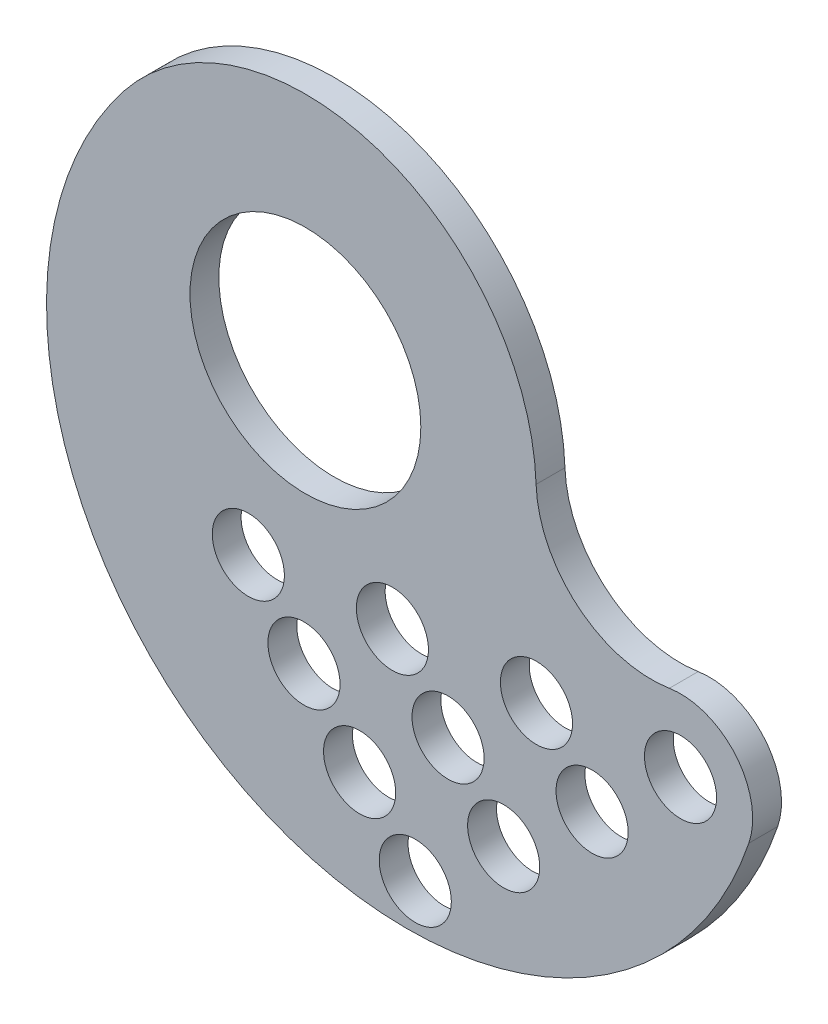
ISO-10303-21;
HEADER;
FILE_DESCRIPTION(('STEP AP214'),'2;1');
FILE_NAME('part.step','',(''),(''),'','','');
FILE_SCHEMA(('AUTOMOTIVE_DESIGN { 1 0 10303 214 1 1 1 1 }'));
ENDSEC;
DATA;
#1=APPLICATION_CONTEXT('core data for automotive mechanical design processes');
#2=APPLICATION_PROTOCOL_DEFINITION('international standard','automotive_design',2000,#1);
#3=PRODUCT_CONTEXT('',#1,'mechanical');
#4=PRODUCT('Part','Part','',(#3));
#5=PRODUCT_RELATED_PRODUCT_CATEGORY('part','',(#4));
#6=PRODUCT_DEFINITION_FORMATION('','',#4);
#7=PRODUCT_DEFINITION_CONTEXT('part definition',#1,'design');
#8=PRODUCT_DEFINITION('design','',#6,#7);
#9=PRODUCT_DEFINITION_SHAPE('','',#8);
#10=(LENGTH_UNIT() NAMED_UNIT(*) SI_UNIT(.MILLI.,.METRE.));
#11=(NAMED_UNIT(*) PLANE_ANGLE_UNIT() SI_UNIT($,.RADIAN.));
#12=(NAMED_UNIT(*) SI_UNIT($,.STERADIAN.) SOLID_ANGLE_UNIT());
#13=UNCERTAINTY_MEASURE_WITH_UNIT(LENGTH_MEASURE(1.E-05),#10,'distance_accuracy_value','');
#14=(GEOMETRIC_REPRESENTATION_CONTEXT(3) GLOBAL_UNCERTAINTY_ASSIGNED_CONTEXT((#13)) GLOBAL_UNIT_ASSIGNED_CONTEXT((#10,
#11,#12)) REPRESENTATION_CONTEXT('',''));
#15=CARTESIAN_POINT('',(0.,0.,0.));
#16=DIRECTION('',(0.,0.,1.));
#17=DIRECTION('',(1.,0.,0.));
#18=AXIS2_PLACEMENT_3D('',#15,#16,#17);
#19=CARTESIAN_POINT('',(124.962982776865,-27.8927039834581,10.));
#20=DIRECTION('',(0.,0.,1.));
#21=DIRECTION('',(1.,0.,0.));
#22=AXIS2_PLACEMENT_3D('',#19,#20,#21);
#23=PLANE('',#22);
#24=CARTESIAN_POINT('',(-0.492589755469286,-91.171846575247,10.));
#25=DIRECTION('',(0.,0.,1.));
#26=DIRECTION('',(1.,0.,0.));
#27=AXIS2_PLACEMENT_3D('',#24,#25,#26);
#28=CIRCLE('',#27,12.5);
#29=CARTESIAN_POINT('',(12.0074102445307,-91.171846575247,10.));
#30=VERTEX_POINT('',#29);
#31=EDGE_CURVE('E166',#30,#30,#28,.T.);
#32=ORIENTED_EDGE('',*,*,#31,.F.);
#33=EDGE_LOOP('',(#32));
#34=FACE_BOUND('',#33,.T.);
#35=CARTESIAN_POINT('',(18.791038535127,-114.153179868816,10.));
#36=DIRECTION('',(0.,0.,1.));
#37=DIRECTION('',(1.,0.,0.));
#38=AXIS2_PLACEMENT_3D('',#35,#36,#37);
#39=CIRCLE('',#38,12.5);
#40=CARTESIAN_POINT('',(31.291038535127,-114.153179868816,10.));
#41=VERTEX_POINT('',#40);
#42=EDGE_CURVE('E154',#41,#41,#39,.T.);
#43=ORIENTED_EDGE('',*,*,#42,.F.);
#44=EDGE_LOOP('',(#43));
#45=FACE_BOUND('',#44,.T.);
#46=CARTESIAN_POINT('',(80.0745939846448,-62.7301710938926,10.));
#47=DIRECTION('',(0.,0.,1.));
#48=DIRECTION('',(1.,0.,0.));
#49=AXIS2_PLACEMENT_3D('',#46,#47,#48);
#50=CIRCLE('',#49,12.5);
#51=CARTESIAN_POINT('',(92.5745939846448,-62.7301710938926,10.));
#52=VERTEX_POINT('',#51);
#53=EDGE_CURVE('E142',#52,#52,#50,.T.);
#54=ORIENTED_EDGE('',*,*,#53,.F.);
#55=EDGE_LOOP('',(#54));
#56=FACE_BOUND('',#55,.T.);
#57=CARTESIAN_POINT('',(68.7164445504822,-111.423008774924,10.));
#58=DIRECTION('',(0.,0.,1.));
#59=DIRECTION('',(1.,0.,0.));
#60=AXIS2_PLACEMENT_3D('',#57,#58,#59);
#61=CIRCLE('',#60,12.5);
#62=CARTESIAN_POINT('',(81.2164445504822,-111.423008774924,10.));
#63=VERTEX_POINT('',#62);
#64=EDGE_CURVE('E130',#63,#63,#61,.T.);
#65=ORIENTED_EDGE('',*,*,#64,.F.);
#66=EDGE_LOOP('',(#65));
#67=FACE_BOUND('',#66,.T.);
#68=CARTESIAN_POINT('',(130.,-60.,10.));
#69=DIRECTION('',(0.,0.,1.));
#70=DIRECTION('',(1.,0.,0.));
#71=AXIS2_PLACEMENT_3D('',#68,#69,#70);
#72=CIRCLE('',#71,12.5);
#73=CARTESIAN_POINT('',(142.5,-60.,10.));
#74=VERTEX_POINT('',#73);
#75=EDGE_CURVE('E118',#74,#74,#72,.T.);
#76=ORIENTED_EDGE('',*,*,#75,.F.);
#77=EDGE_LOOP('',(#76));
#78=FACE_BOUND('',#77,.T.);
#79=CARTESIAN_POINT('',(119.925965553731,4.21459203308376,10.));
#80=DIRECTION('',(0.,0.,-1.));
#81=DIRECTION('',(1.,0.,0.));
#82=AXIS2_PLACEMENT_3D('',#79,#80,#81);
#83=CIRCLE('',#82,40.);
#84=CARTESIAN_POINT('',(126.12537136682,-35.3020799872755,10.));
#85=VERTEX_POINT('',#84);
#86=CARTESIAN_POINT('',(79.9506437024873,2.80972802205584,10.));
#87=VERTEX_POINT('',#86);
#88=EDGE_CURVE('E88',#85,#87,#83,.T.);
#89=ORIENTED_EDGE('',*,*,#88,.T.);
#90=CARTESIAN_POINT('',(0.,0.,10.));
#91=DIRECTION('',(0.,0.,1.));
#92=DIRECTION('',(1.,0.,0.));
#93=AXIS2_PLACEMENT_3D('',#90,#91,#92);
#94=CIRCLE('',#93,80.);
#95=CARTESIAN_POINT('',(-62.7215009406275,49.6589701841959,10.));
#96=VERTEX_POINT('',#95);
#97=EDGE_CURVE('E83',#87,#96,#94,.T.);
#98=ORIENTED_EDGE('',*,*,#97,.T.);
#99=CARTESIAN_POINT('',(35.280844279103,-27.9331707286102,10.));
#100=DIRECTION('',(0.,0.,1.));
#101=DIRECTION('',(1.,0.,0.));
#102=AXIS2_PLACEMENT_3D('',#99,#100,#101);
#103=CIRCLE('',#102,125.);
#104=CARTESIAN_POINT('',(153.679788930224,-68.0167073178475,10.));
#105=VERTEX_POINT('',#104);
#106=EDGE_CURVE('E86',#96,#105,#103,.T.);
#107=ORIENTED_EDGE('',*,*,#106,.T.);
#108=CARTESIAN_POINT('',(130.,-60.,10.));
#109=DIRECTION('',(0.,0.,1.));
#110=DIRECTION('',(1.,0.,0.));
#111=AXIS2_PLACEMENT_3D('',#108,#109,#110);
#112=CIRCLE('',#111,25.);
#113=EDGE_CURVE('E53',#105,#85,#112,.T.);
#114=ORIENTED_EDGE('',*,*,#113,.T.);
#115=EDGE_LOOP('',(#89,#98,#107,#114));
#116=FACE_BOUND('',#115,.T.);
#117=CARTESIAN_POINT('',(0.,0.,10.));
#118=DIRECTION('',(0.,0.,1.));
#119=DIRECTION('',(1.,0.,0.));
#120=AXIS2_PLACEMENT_3D('',#117,#118,#119);
#121=CIRCLE('',#120,40.);
#122=CARTESIAN_POINT('',(40.,0.,10.));
#123=VERTEX_POINT('',#122);
#124=EDGE_CURVE('E103',#123,#123,#121,.T.);
#125=ORIENTED_EDGE('',*,*,#124,.F.);
#126=EDGE_LOOP('',(#125));
#127=FACE_BOUND('',#126,.T.);
#128=CARTESIAN_POINT('',(99.3582222752411,-85.7115043874618,10.));
#129=DIRECTION('',(0.,0.,1.));
#130=DIRECTION('',(1.,0.,0.));
#131=AXIS2_PLACEMENT_3D('',#128,#129,#130);
#132=CIRCLE('',#131,12.5);
#133=CARTESIAN_POINT('',(111.858222275241,-85.7115043874618,10.));
#134=VERTEX_POINT('',#133);
#135=EDGE_CURVE('E124',#134,#134,#132,.T.);
#136=ORIENTED_EDGE('',*,*,#135,.F.);
#137=EDGE_LOOP('',(#136));
#138=FACE_BOUND('',#137,.T.);
#139=CARTESIAN_POINT('',(38.0746668257233,-137.134513162386,10.));
#140=DIRECTION('',(0.,0.,1.));
#141=DIRECTION('',(1.,0.,0.));
#142=AXIS2_PLACEMENT_3D('',#139,#140,#141);
#143=CIRCLE('',#142,12.5);
#144=CARTESIAN_POINT('',(50.5746668257233,-137.134513162386,10.));
#145=VERTEX_POINT('',#144);
#146=EDGE_CURVE('E136',#145,#145,#143,.T.);
#147=ORIENTED_EDGE('',*,*,#146,.F.);
#148=EDGE_LOOP('',(#147));
#149=FACE_BOUND('',#148,.T.);
#150=CARTESIAN_POINT('',(49.4328162598859,-88.4416754813544,10.));
#151=DIRECTION('',(0.,0.,1.));
#152=DIRECTION('',(1.,0.,0.));
#153=AXIS2_PLACEMENT_3D('',#150,#151,#152);
#154=CIRCLE('',#153,12.5);
#155=CARTESIAN_POINT('',(61.9328162598859,-88.4416754813544,10.));
#156=VERTEX_POINT('',#155);
#157=EDGE_CURVE('E148',#156,#156,#154,.T.);
#158=ORIENTED_EDGE('',*,*,#157,.F.);
#159=EDGE_LOOP('',(#158));
#160=FACE_BOUND('',#159,.T.);
#161=CARTESIAN_POINT('',(30.1491879692896,-65.4603421877852,10.));
#162=DIRECTION('',(0.,0.,1.));
#163=DIRECTION('',(1.,0.,0.));
#164=AXIS2_PLACEMENT_3D('',#161,#162,#163);
#165=CIRCLE('',#164,12.5);
#166=CARTESIAN_POINT('',(42.6491879692896,-65.4603421877852,10.));
#167=VERTEX_POINT('',#166);
#168=EDGE_CURVE('E160',#167,#167,#165,.T.);
#169=ORIENTED_EDGE('',*,*,#168,.F.);
#170=EDGE_LOOP('',(#169));
#171=FACE_BOUND('',#170,.T.);
#172=CARTESIAN_POINT('',(-19.7762180460656,-68.1905132816778,10.));
#173=DIRECTION('',(0.,0.,1.));
#174=DIRECTION('',(1.,0.,0.));
#175=AXIS2_PLACEMENT_3D('',#172,#173,#174);
#176=CIRCLE('',#175,12.5);
#177=CARTESIAN_POINT('',(-7.27621804606558,-68.1905132816778,10.));
#178=VERTEX_POINT('',#177);
#179=EDGE_CURVE('E172',#178,#178,#176,.T.);
#180=ORIENTED_EDGE('',*,*,#179,.F.);
#181=EDGE_LOOP('',(#180));
#182=FACE_BOUND('',#181,.T.);
#183=ADVANCED_FACE('F36',(#34,#45,#56,#67,#78,#116,#127,#138,#149,#160,#171,#182),#23,.T.);
#184=CARTESIAN_POINT('',(124.962982776865,-27.8927039834581,0.));
#185=DIRECTION('',(0.,0.,1.));
#186=DIRECTION('',(1.,0.,0.));
#187=AXIS2_PLACEMENT_3D('',#184,#185,#186);
#188=PLANE('',#187);
#189=CARTESIAN_POINT('',(119.925965553731,4.21459203308376,0.));
#190=DIRECTION('',(0.,0.,-1.));
#191=DIRECTION('',(1.,0.,0.));
#192=AXIS2_PLACEMENT_3D('',#189,#190,#191);
#193=CIRCLE('',#192,40.);
#194=CARTESIAN_POINT('',(126.12537136682,-35.3020799872755,0.));
#195=VERTEX_POINT('',#194);
#196=CARTESIAN_POINT('',(79.9506437024873,2.80972802205584,0.));
#197=VERTEX_POINT('',#196);
#198=EDGE_CURVE('E100',#195,#197,#193,.T.);
#199=ORIENTED_EDGE('',*,*,#198,.F.);
#200=CARTESIAN_POINT('',(130.,-60.,0.));
#201=DIRECTION('',(0.,0.,1.));
#202=DIRECTION('',(1.,0.,0.));
#203=AXIS2_PLACEMENT_3D('',#200,#201,#202);
#204=CIRCLE('',#203,25.);
#205=CARTESIAN_POINT('',(153.679788930224,-68.0167073178475,0.));
#206=VERTEX_POINT('',#205);
#207=EDGE_CURVE('E76',#206,#195,#204,.T.);
#208=ORIENTED_EDGE('',*,*,#207,.F.);
#209=CARTESIAN_POINT('',(35.280844279103,-27.9331707286102,0.));
#210=DIRECTION('',(0.,0.,1.));
#211=DIRECTION('',(1.,0.,0.));
#212=AXIS2_PLACEMENT_3D('',#209,#210,#211);
#213=CIRCLE('',#212,125.);
#214=CARTESIAN_POINT('',(-62.7215009406275,49.6589701841959,0.));
#215=VERTEX_POINT('',#214);
#216=EDGE_CURVE('E70',#215,#206,#213,.T.);
#217=ORIENTED_EDGE('',*,*,#216,.F.);
#218=CARTESIAN_POINT('',(0.,0.,0.));
#219=DIRECTION('',(0.,0.,1.));
#220=DIRECTION('',(1.,0.,0.));
#221=AXIS2_PLACEMENT_3D('',#218,#219,#220);
#222=CIRCLE('',#221,80.);
#223=EDGE_CURVE('E92',#197,#215,#222,.T.);
#224=ORIENTED_EDGE('',*,*,#223,.F.);
#225=EDGE_LOOP('',(#199,#208,#217,#224));
#226=FACE_BOUND('',#225,.T.);
#227=CARTESIAN_POINT('',(0.,0.,0.));
#228=DIRECTION('',(0.,0.,1.));
#229=DIRECTION('',(1.,0.,0.));
#230=AXIS2_PLACEMENT_3D('',#227,#228,#229);
#231=CIRCLE('',#230,40.);
#232=CARTESIAN_POINT('',(40.,0.,0.));
#233=VERTEX_POINT('',#232);
#234=EDGE_CURVE('E115',#233,#233,#231,.T.);
#235=ORIENTED_EDGE('',*,*,#234,.T.);
#236=EDGE_LOOP('',(#235));
#237=FACE_BOUND('',#236,.T.);
#238=CARTESIAN_POINT('',(130.,-60.,0.));
#239=DIRECTION('',(0.,0.,1.));
#240=DIRECTION('',(1.,0.,0.));
#241=AXIS2_PLACEMENT_3D('',#238,#239,#240);
#242=CIRCLE('',#241,12.5);
#243=CARTESIAN_POINT('',(142.5,-60.,0.));
#244=VERTEX_POINT('',#243);
#245=EDGE_CURVE('E121',#244,#244,#242,.T.);
#246=ORIENTED_EDGE('',*,*,#245,.T.);
#247=EDGE_LOOP('',(#246));
#248=FACE_BOUND('',#247,.T.);
#249=CARTESIAN_POINT('',(99.3582222752411,-85.7115043874618,0.));
#250=DIRECTION('',(0.,0.,1.));
#251=DIRECTION('',(1.,0.,0.));
#252=AXIS2_PLACEMENT_3D('',#249,#250,#251);
#253=CIRCLE('',#252,12.5);
#254=CARTESIAN_POINT('',(111.858222275241,-85.7115043874618,0.));
#255=VERTEX_POINT('',#254);
#256=EDGE_CURVE('E127',#255,#255,#253,.T.);
#257=ORIENTED_EDGE('',*,*,#256,.T.);
#258=EDGE_LOOP('',(#257));
#259=FACE_BOUND('',#258,.T.);
#260=CARTESIAN_POINT('',(68.7164445504822,-111.423008774924,0.));
#261=DIRECTION('',(0.,0.,1.));
#262=DIRECTION('',(1.,0.,0.));
#263=AXIS2_PLACEMENT_3D('',#260,#261,#262);
#264=CIRCLE('',#263,12.5);
#265=CARTESIAN_POINT('',(81.2164445504822,-111.423008774924,0.));
#266=VERTEX_POINT('',#265);
#267=EDGE_CURVE('E133',#266,#266,#264,.T.);
#268=ORIENTED_EDGE('',*,*,#267,.T.);
#269=EDGE_LOOP('',(#268));
#270=FACE_BOUND('',#269,.T.);
#271=CARTESIAN_POINT('',(38.0746668257233,-137.134513162386,0.));
#272=DIRECTION('',(0.,0.,1.));
#273=DIRECTION('',(1.,0.,0.));
#274=AXIS2_PLACEMENT_3D('',#271,#272,#273);
#275=CIRCLE('',#274,12.5);
#276=CARTESIAN_POINT('',(50.5746668257233,-137.134513162386,0.));
#277=VERTEX_POINT('',#276);
#278=EDGE_CURVE('E139',#277,#277,#275,.T.);
#279=ORIENTED_EDGE('',*,*,#278,.T.);
#280=EDGE_LOOP('',(#279));
#281=FACE_BOUND('',#280,.T.);
#282=CARTESIAN_POINT('',(80.0745939846448,-62.7301710938926,0.));
#283=DIRECTION('',(0.,0.,1.));
#284=DIRECTION('',(1.,0.,0.));
#285=AXIS2_PLACEMENT_3D('',#282,#283,#284);
#286=CIRCLE('',#285,12.5);
#287=CARTESIAN_POINT('',(92.5745939846448,-62.7301710938926,0.));
#288=VERTEX_POINT('',#287);
#289=EDGE_CURVE('E145',#288,#288,#286,.T.);
#290=ORIENTED_EDGE('',*,*,#289,.T.);
#291=EDGE_LOOP('',(#290));
#292=FACE_BOUND('',#291,.T.);
#293=CARTESIAN_POINT('',(49.4328162598859,-88.4416754813544,0.));
#294=DIRECTION('',(0.,0.,1.));
#295=DIRECTION('',(1.,0.,0.));
#296=AXIS2_PLACEMENT_3D('',#293,#294,#295);
#297=CIRCLE('',#296,12.5);
#298=CARTESIAN_POINT('',(61.9328162598859,-88.4416754813544,0.));
#299=VERTEX_POINT('',#298);
#300=EDGE_CURVE('E151',#299,#299,#297,.T.);
#301=ORIENTED_EDGE('',*,*,#300,.T.);
#302=EDGE_LOOP('',(#301));
#303=FACE_BOUND('',#302,.T.);
#304=CARTESIAN_POINT('',(18.791038535127,-114.153179868816,0.));
#305=DIRECTION('',(0.,0.,1.));
#306=DIRECTION('',(1.,0.,0.));
#307=AXIS2_PLACEMENT_3D('',#304,#305,#306);
#308=CIRCLE('',#307,12.5);
#309=CARTESIAN_POINT('',(31.291038535127,-114.153179868816,0.));
#310=VERTEX_POINT('',#309);
#311=EDGE_CURVE('E157',#310,#310,#308,.T.);
#312=ORIENTED_EDGE('',*,*,#311,.T.);
#313=EDGE_LOOP('',(#312));
#314=FACE_BOUND('',#313,.T.);
#315=CARTESIAN_POINT('',(30.1491879692896,-65.4603421877852,0.));
#316=DIRECTION('',(0.,0.,1.));
#317=DIRECTION('',(1.,0.,0.));
#318=AXIS2_PLACEMENT_3D('',#315,#316,#317);
#319=CIRCLE('',#318,12.5);
#320=CARTESIAN_POINT('',(42.6491879692896,-65.4603421877852,0.));
#321=VERTEX_POINT('',#320);
#322=EDGE_CURVE('E163',#321,#321,#319,.T.);
#323=ORIENTED_EDGE('',*,*,#322,.T.);
#324=EDGE_LOOP('',(#323));
#325=FACE_BOUND('',#324,.T.);
#326=CARTESIAN_POINT('',(-0.492589755469286,-91.171846575247,0.));
#327=DIRECTION('',(0.,0.,1.));
#328=DIRECTION('',(1.,0.,0.));
#329=AXIS2_PLACEMENT_3D('',#326,#327,#328);
#330=CIRCLE('',#329,12.5);
#331=CARTESIAN_POINT('',(12.0074102445307,-91.171846575247,0.));
#332=VERTEX_POINT('',#331);
#333=EDGE_CURVE('E169',#332,#332,#330,.T.);
#334=ORIENTED_EDGE('',*,*,#333,.T.);
#335=EDGE_LOOP('',(#334));
#336=FACE_BOUND('',#335,.T.);
#337=CARTESIAN_POINT('',(-19.7762180460656,-68.1905132816778,0.));
#338=DIRECTION('',(0.,0.,1.));
#339=DIRECTION('',(1.,0.,0.));
#340=AXIS2_PLACEMENT_3D('',#337,#338,#339);
#341=CIRCLE('',#340,12.5);
#342=CARTESIAN_POINT('',(-7.27621804606558,-68.1905132816778,0.));
#343=VERTEX_POINT('',#342);
#344=EDGE_CURVE('E175',#343,#343,#341,.T.);
#345=ORIENTED_EDGE('',*,*,#344,.T.);
#346=EDGE_LOOP('',(#345));
#347=FACE_BOUND('',#346,.T.);
#348=ADVANCED_FACE('F111',(#226,#237,#248,#259,#270,#281,#292,#303,#314,#325,#336,#347),#188,.F.);
#349=CARTESIAN_POINT('',(119.925965553731,4.21459203308376,10.));
#350=DIRECTION('',(0.,0.,-1.));
#351=DIRECTION('',(-1.,0.,0.));
#352=AXIS2_PLACEMENT_3D('',#349,#350,#351);
#353=CYLINDRICAL_SURFACE('',#352,40.);
#354=ORIENTED_EDGE('',*,*,#198,.T.);
#355=DIRECTION('',(0.,0.,-1.));
#356=VECTOR('',#355,1.);
#357=CARTESIAN_POINT('',(79.9506437024873,2.80972802205584,10.));
#358=LINE('',#357,#356);
#359=EDGE_CURVE('E11',#87,#197,#358,.T.);
#360=ORIENTED_EDGE('',*,*,#359,.F.);
#361=ORIENTED_EDGE('',*,*,#88,.F.);
#362=DIRECTION('',(0.,0.,-1.));
#363=VECTOR('',#362,1.);
#364=CARTESIAN_POINT('',(126.12537136682,-35.3020799872755,10.));
#365=LINE('',#364,#363);
#366=EDGE_CURVE('E96',#85,#195,#365,.T.);
#367=ORIENTED_EDGE('',*,*,#366,.T.);
#368=EDGE_LOOP('',(#354,#360,#361,#367));
#369=FACE_BOUND('',#368,.T.);
#370=ADVANCED_FACE('F38',(#369),#353,.F.);
#371=CARTESIAN_POINT('',(0.,0.,10.));
#372=DIRECTION('',(0.,0.,-1.));
#373=DIRECTION('',(-1.,0.,0.));
#374=AXIS2_PLACEMENT_3D('',#371,#372,#373);
#375=CYLINDRICAL_SURFACE('',#374,80.);
#376=ORIENTED_EDGE('',*,*,#223,.T.);
#377=DIRECTION('',(0.,0.,-1.));
#378=VECTOR('',#377,1.);
#379=CARTESIAN_POINT('',(-62.7215009406275,49.6589701841959,10.));
#380=LINE('',#379,#378);
#381=EDGE_CURVE('E45',#96,#215,#380,.T.);
#382=ORIENTED_EDGE('',*,*,#381,.F.);
#383=ORIENTED_EDGE('',*,*,#97,.F.);
#384=ORIENTED_EDGE('',*,*,#359,.T.);
#385=EDGE_LOOP('',(#376,#382,#383,#384));
#386=FACE_BOUND('',#385,.T.);
#387=ADVANCED_FACE('F91',(#386),#375,.T.);
#388=CARTESIAN_POINT('',(35.280844279103,-27.9331707286102,10.));
#389=DIRECTION('',(0.,0.,-1.));
#390=DIRECTION('',(-1.,0.,0.));
#391=AXIS2_PLACEMENT_3D('',#388,#389,#390);
#392=CYLINDRICAL_SURFACE('',#391,125.);
#393=ORIENTED_EDGE('',*,*,#216,.T.);
#394=DIRECTION('',(0.,0.,-1.));
#395=VECTOR('',#394,1.);
#396=CARTESIAN_POINT('',(153.679788930224,-68.0167073178475,10.));
#397=LINE('',#396,#395);
#398=EDGE_CURVE('E93',#105,#206,#397,.T.);
#399=ORIENTED_EDGE('',*,*,#398,.F.);
#400=ORIENTED_EDGE('',*,*,#106,.F.);
#401=ORIENTED_EDGE('',*,*,#381,.T.);
#402=EDGE_LOOP('',(#393,#399,#400,#401));
#403=FACE_BOUND('',#402,.T.);
#404=ADVANCED_FACE('F94',(#403),#392,.T.);
#405=CARTESIAN_POINT('',(130.,-60.,10.));
#406=DIRECTION('',(0.,0.,-1.));
#407=DIRECTION('',(-1.,0.,0.));
#408=AXIS2_PLACEMENT_3D('',#405,#406,#407);
#409=CYLINDRICAL_SURFACE('',#408,25.);
#410=ORIENTED_EDGE('',*,*,#207,.T.);
#411=ORIENTED_EDGE('',*,*,#366,.F.);
#412=ORIENTED_EDGE('',*,*,#113,.F.);
#413=ORIENTED_EDGE('',*,*,#398,.T.);
#414=EDGE_LOOP('',(#410,#411,#412,#413));
#415=FACE_BOUND('',#414,.T.);
#416=ADVANCED_FACE('F108',(#415),#409,.T.);
#417=CARTESIAN_POINT('',(0.,0.,10.));
#418=DIRECTION('',(0.,0.,-1.));
#419=DIRECTION('',(-1.,0.,0.));
#420=AXIS2_PLACEMENT_3D('',#417,#418,#419);
#421=CYLINDRICAL_SURFACE('',#420,40.);
#422=ORIENTED_EDGE('',*,*,#124,.T.);
#423=EDGE_LOOP('',(#422));
#424=FACE_BOUND('',#423,.T.);
#425=ORIENTED_EDGE('',*,*,#234,.F.);
#426=EDGE_LOOP('',(#425));
#427=FACE_BOUND('',#426,.T.);
#428=ADVANCED_FACE('F194',(#424,#427),#421,.F.);
#429=CARTESIAN_POINT('',(130.,-60.,10.));
#430=DIRECTION('',(0.,0.,-1.));
#431=DIRECTION('',(-1.,0.,0.));
#432=AXIS2_PLACEMENT_3D('',#429,#430,#431);
#433=CYLINDRICAL_SURFACE('',#432,12.5);
#434=ORIENTED_EDGE('',*,*,#75,.T.);
#435=EDGE_LOOP('',(#434));
#436=FACE_BOUND('',#435,.T.);
#437=ORIENTED_EDGE('',*,*,#245,.F.);
#438=EDGE_LOOP('',(#437));
#439=FACE_BOUND('',#438,.T.);
#440=ADVANCED_FACE('F240',(#436,#439),#433,.F.);
#441=CARTESIAN_POINT('',(99.3582222752411,-85.7115043874618,10.));
#442=DIRECTION('',(0.,0.,-1.));
#443=DIRECTION('',(-1.,0.,0.));
#444=AXIS2_PLACEMENT_3D('',#441,#442,#443);
#445=CYLINDRICAL_SURFACE('',#444,12.5);
#446=ORIENTED_EDGE('',*,*,#135,.T.);
#447=EDGE_LOOP('',(#446));
#448=FACE_BOUND('',#447,.T.);
#449=ORIENTED_EDGE('',*,*,#256,.F.);
#450=EDGE_LOOP('',(#449));
#451=FACE_BOUND('',#450,.T.);
#452=ADVANCED_FACE('F248',(#448,#451),#445,.F.);
#453=CARTESIAN_POINT('',(68.7164445504822,-111.423008774924,10.));
#454=DIRECTION('',(0.,0.,-1.));
#455=DIRECTION('',(-1.,0.,0.));
#456=AXIS2_PLACEMENT_3D('',#453,#454,#455);
#457=CYLINDRICAL_SURFACE('',#456,12.5);
#458=ORIENTED_EDGE('',*,*,#64,.T.);
#459=EDGE_LOOP('',(#458));
#460=FACE_BOUND('',#459,.T.);
#461=ORIENTED_EDGE('',*,*,#267,.F.);
#462=EDGE_LOOP('',(#461));
#463=FACE_BOUND('',#462,.T.);
#464=ADVANCED_FACE('F256',(#460,#463),#457,.F.);
#465=CARTESIAN_POINT('',(38.0746668257233,-137.134513162386,10.));
#466=DIRECTION('',(0.,0.,-1.));
#467=DIRECTION('',(-1.,0.,0.));
#468=AXIS2_PLACEMENT_3D('',#465,#466,#467);
#469=CYLINDRICAL_SURFACE('',#468,12.5);
#470=ORIENTED_EDGE('',*,*,#146,.T.);
#471=EDGE_LOOP('',(#470));
#472=FACE_BOUND('',#471,.T.);
#473=ORIENTED_EDGE('',*,*,#278,.F.);
#474=EDGE_LOOP('',(#473));
#475=FACE_BOUND('',#474,.T.);
#476=ADVANCED_FACE('F265',(#472,#475),#469,.F.);
#477=CARTESIAN_POINT('',(80.0745939846448,-62.7301710938926,10.));
#478=DIRECTION('',(0.,0.,-1.));
#479=DIRECTION('',(-1.,0.,0.));
#480=AXIS2_PLACEMENT_3D('',#477,#478,#479);
#481=CYLINDRICAL_SURFACE('',#480,12.5);
#482=ORIENTED_EDGE('',*,*,#53,.T.);
#483=EDGE_LOOP('',(#482));
#484=FACE_BOUND('',#483,.T.);
#485=ORIENTED_EDGE('',*,*,#289,.F.);
#486=EDGE_LOOP('',(#485));
#487=FACE_BOUND('',#486,.T.);
#488=ADVANCED_FACE('F274',(#484,#487),#481,.F.);
#489=CARTESIAN_POINT('',(49.4328162598859,-88.4416754813544,10.));
#490=DIRECTION('',(0.,0.,-1.));
#491=DIRECTION('',(-1.,0.,0.));
#492=AXIS2_PLACEMENT_3D('',#489,#490,#491);
#493=CYLINDRICAL_SURFACE('',#492,12.5);
#494=ORIENTED_EDGE('',*,*,#157,.T.);
#495=EDGE_LOOP('',(#494));
#496=FACE_BOUND('',#495,.T.);
#497=ORIENTED_EDGE('',*,*,#300,.F.);
#498=EDGE_LOOP('',(#497));
#499=FACE_BOUND('',#498,.T.);
#500=ADVANCED_FACE('F283',(#496,#499),#493,.F.);
#501=CARTESIAN_POINT('',(18.791038535127,-114.153179868816,10.));
#502=DIRECTION('',(0.,0.,-1.));
#503=DIRECTION('',(-1.,0.,0.));
#504=AXIS2_PLACEMENT_3D('',#501,#502,#503);
#505=CYLINDRICAL_SURFACE('',#504,12.5);
#506=ORIENTED_EDGE('',*,*,#42,.T.);
#507=EDGE_LOOP('',(#506));
#508=FACE_BOUND('',#507,.T.);
#509=ORIENTED_EDGE('',*,*,#311,.F.);
#510=EDGE_LOOP('',(#509));
#511=FACE_BOUND('',#510,.T.);
#512=ADVANCED_FACE('F292',(#508,#511),#505,.F.);
#513=CARTESIAN_POINT('',(30.1491879692896,-65.4603421877852,10.));
#514=DIRECTION('',(0.,0.,-1.));
#515=DIRECTION('',(-1.,0.,0.));
#516=AXIS2_PLACEMENT_3D('',#513,#514,#515);
#517=CYLINDRICAL_SURFACE('',#516,12.5);
#518=ORIENTED_EDGE('',*,*,#168,.T.);
#519=EDGE_LOOP('',(#518));
#520=FACE_BOUND('',#519,.T.);
#521=ORIENTED_EDGE('',*,*,#322,.F.);
#522=EDGE_LOOP('',(#521));
#523=FACE_BOUND('',#522,.T.);
#524=ADVANCED_FACE('F301',(#520,#523),#517,.F.);
#525=CARTESIAN_POINT('',(-0.492589755469286,-91.171846575247,10.));
#526=DIRECTION('',(0.,0.,-1.));
#527=DIRECTION('',(-1.,0.,0.));
#528=AXIS2_PLACEMENT_3D('',#525,#526,#527);
#529=CYLINDRICAL_SURFACE('',#528,12.5);
#530=ORIENTED_EDGE('',*,*,#31,.T.);
#531=EDGE_LOOP('',(#530));
#532=FACE_BOUND('',#531,.T.);
#533=ORIENTED_EDGE('',*,*,#333,.F.);
#534=EDGE_LOOP('',(#533));
#535=FACE_BOUND('',#534,.T.);
#536=ADVANCED_FACE('F310',(#532,#535),#529,.F.);
#537=CARTESIAN_POINT('',(-19.7762180460656,-68.1905132816778,10.));
#538=DIRECTION('',(0.,0.,-1.));
#539=DIRECTION('',(-1.,0.,0.));
#540=AXIS2_PLACEMENT_3D('',#537,#538,#539);
#541=CYLINDRICAL_SURFACE('',#540,12.5);
#542=ORIENTED_EDGE('',*,*,#179,.T.);
#543=EDGE_LOOP('',(#542));
#544=FACE_BOUND('',#543,.T.);
#545=ORIENTED_EDGE('',*,*,#344,.F.);
#546=EDGE_LOOP('',(#545));
#547=FACE_BOUND('',#546,.T.);
#548=ADVANCED_FACE('F181',(#544,#547),#541,.F.);
#549=CLOSED_SHELL('',(#183,#348,#370,#387,#404,#416,#428,#440,#452,#464,#476,#488,#500,#512,
#524,#536,#548));
#550=MANIFOLD_SOLID_BREP('B2',#549);
#551=ADVANCED_BREP_SHAPE_REPRESENTATION('',(#18,#550),#14);
#552=SHAPE_DEFINITION_REPRESENTATION(#9,#551);
ENDSEC;
END-ISO-10303-21;
